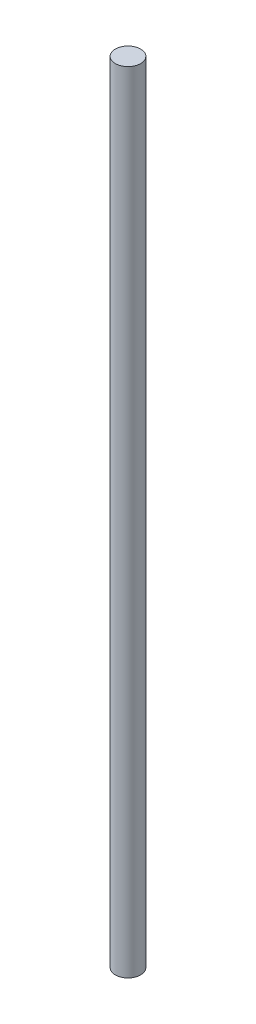
ISO-10303-21;
HEADER;
FILE_DESCRIPTION(('STEP AP214'),'2;1');
FILE_NAME('part.step','',(''),(''),'','','');
FILE_SCHEMA(('AUTOMOTIVE_DESIGN { 1 0 10303 214 1 1 1 1 }'));
ENDSEC;
DATA;
#1=APPLICATION_CONTEXT('core data for automotive mechanical design processes');
#2=APPLICATION_PROTOCOL_DEFINITION('international standard','automotive_design',2000,#1);
#3=PRODUCT_CONTEXT('',#1,'mechanical');
#4=PRODUCT('Part','Part','',(#3));
#5=PRODUCT_RELATED_PRODUCT_CATEGORY('part','',(#4));
#6=PRODUCT_DEFINITION_FORMATION('','',#4);
#7=PRODUCT_DEFINITION_CONTEXT('part definition',#1,'design');
#8=PRODUCT_DEFINITION('design','',#6,#7);
#9=PRODUCT_DEFINITION_SHAPE('','',#8);
#10=(LENGTH_UNIT() NAMED_UNIT(*) SI_UNIT(.MILLI.,.METRE.));
#11=(NAMED_UNIT(*) PLANE_ANGLE_UNIT() SI_UNIT($,.RADIAN.));
#12=(NAMED_UNIT(*) SI_UNIT($,.STERADIAN.) SOLID_ANGLE_UNIT());
#13=UNCERTAINTY_MEASURE_WITH_UNIT(LENGTH_MEASURE(1.E-05),#10,'distance_accuracy_value','');
#14=(GEOMETRIC_REPRESENTATION_CONTEXT(3) GLOBAL_UNCERTAINTY_ASSIGNED_CONTEXT((#13)) GLOBAL_UNIT_ASSIGNED_CONTEXT((#10,
#11,#12)) REPRESENTATION_CONTEXT('',''));
#15=CARTESIAN_POINT('',(0.,0.,0.));
#16=DIRECTION('',(0.,0.,1.));
#17=DIRECTION('',(1.,0.,0.));
#18=AXIS2_PLACEMENT_3D('',#15,#16,#17);
#19=CARTESIAN_POINT('',(0.,125.,0.));
#20=DIRECTION('',(0.,-1.,0.));
#21=DIRECTION('',(0.,0.,-1.));
#22=AXIS2_PLACEMENT_3D('',#19,#20,#21);
#23=CYLINDRICAL_SURFACE('',#22,4.);
#24=CARTESIAN_POINT('',(0.,125.,0.));
#25=DIRECTION('',(0.,1.,0.));
#26=DIRECTION('',(0.,0.,1.));
#27=AXIS2_PLACEMENT_3D('',#24,#25,#26);
#28=CIRCLE('',#27,4.);
#29=CARTESIAN_POINT('',(0.,125.,4.));
#30=VERTEX_POINT('',#29);
#31=EDGE_CURVE('E10',#30,#30,#28,.T.);
#32=ORIENTED_EDGE('',*,*,#31,.F.);
#33=EDGE_LOOP('',(#32));
#34=FACE_BOUND('',#33,.T.);
#35=CARTESIAN_POINT('',(0.,-125.,0.));
#36=DIRECTION('',(0.,1.,0.));
#37=DIRECTION('',(0.,0.,1.));
#38=AXIS2_PLACEMENT_3D('',#35,#36,#37);
#39=CIRCLE('',#38,4.);
#40=CARTESIAN_POINT('',(0.,-125.,4.));
#41=VERTEX_POINT('',#40);
#42=EDGE_CURVE('E42',#41,#41,#39,.T.);
#43=ORIENTED_EDGE('',*,*,#42,.T.);
#44=EDGE_LOOP('',(#43));
#45=FACE_BOUND('',#44,.T.);
#46=ADVANCED_FACE('F39',(#34,#45),#23,.T.);
#47=CARTESIAN_POINT('',(0.,125.,0.));
#48=DIRECTION('',(0.,1.,0.));
#49=DIRECTION('',(0.,0.,1.));
#50=AXIS2_PLACEMENT_3D('',#47,#48,#49);
#51=PLANE('',#50);
#52=ORIENTED_EDGE('',*,*,#31,.T.);
#53=EDGE_LOOP('',(#52));
#54=FACE_BOUND('',#53,.T.);
#55=ADVANCED_FACE('F56',(#54),#51,.T.);
#56=CARTESIAN_POINT('',(0.,-125.,0.));
#57=DIRECTION('',(0.,1.,0.));
#58=DIRECTION('',(0.,0.,1.));
#59=AXIS2_PLACEMENT_3D('',#56,#57,#58);
#60=PLANE('',#59);
#61=ORIENTED_EDGE('',*,*,#42,.F.);
#62=EDGE_LOOP('',(#61));
#63=FACE_BOUND('',#62,.T.);
#64=ADVANCED_FACE('F54',(#63),#60,.F.);
#65=CLOSED_SHELL('',(#46,#55,#64));
#66=MANIFOLD_SOLID_BREP('B2',#65);
#67=ADVANCED_BREP_SHAPE_REPRESENTATION('',(#18,#66),#14);
#68=SHAPE_DEFINITION_REPRESENTATION(#9,#67);
ENDSEC;
END-ISO-10303-21;
